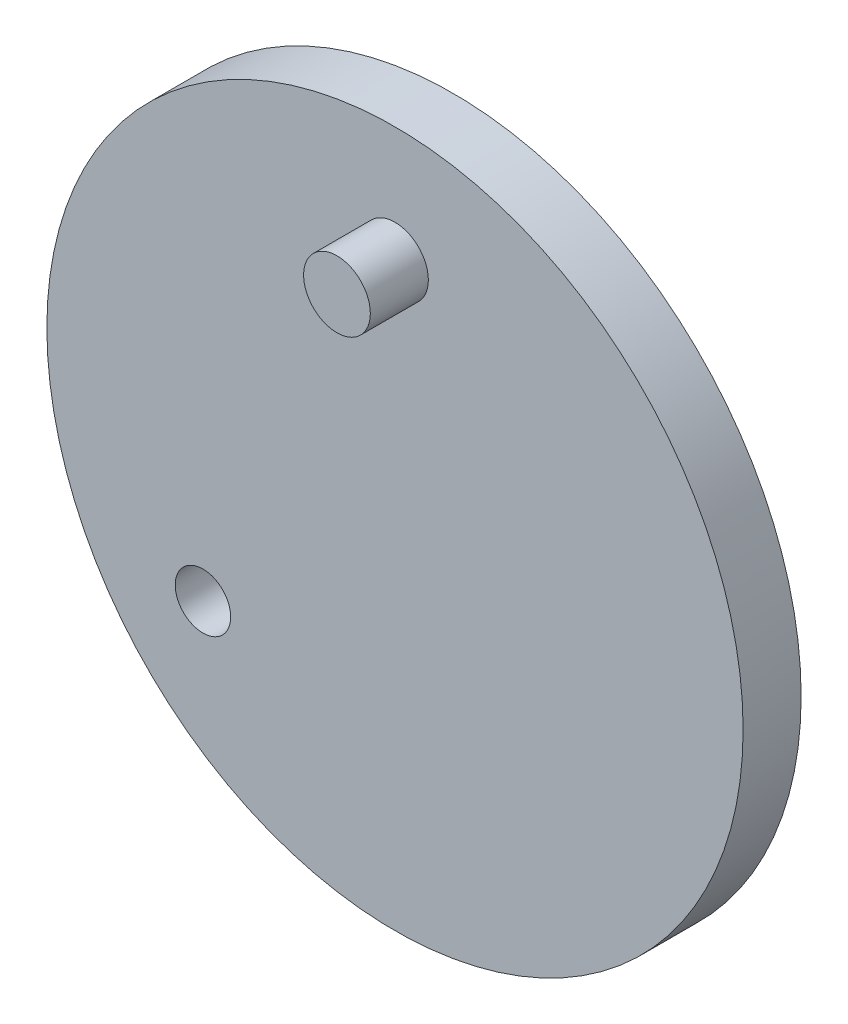
ISO-10303-21;
HEADER;
FILE_DESCRIPTION(('STEP AP214'),'2;1');
FILE_NAME('part.step','',(''),(''),'','','');
FILE_SCHEMA(('AUTOMOTIVE_DESIGN { 1 0 10303 214 1 1 1 1 }'));
ENDSEC;
DATA;
#1=APPLICATION_CONTEXT('core data for automotive mechanical design processes');
#2=APPLICATION_PROTOCOL_DEFINITION('international standard','automotive_design',2000,#1);
#3=PRODUCT_CONTEXT('',#1,'mechanical');
#4=PRODUCT('Part','Part','',(#3));
#5=PRODUCT_RELATED_PRODUCT_CATEGORY('part','',(#4));
#6=PRODUCT_DEFINITION_FORMATION('','',#4);
#7=PRODUCT_DEFINITION_CONTEXT('part definition',#1,'design');
#8=PRODUCT_DEFINITION('design','',#6,#7);
#9=PRODUCT_DEFINITION_SHAPE('','',#8);
#10=(LENGTH_UNIT() NAMED_UNIT(*) SI_UNIT(.MILLI.,.METRE.));
#11=(NAMED_UNIT(*) PLANE_ANGLE_UNIT() SI_UNIT($,.RADIAN.));
#12=(NAMED_UNIT(*) SI_UNIT($,.STERADIAN.) SOLID_ANGLE_UNIT());
#13=UNCERTAINTY_MEASURE_WITH_UNIT(LENGTH_MEASURE(1.E-05),#10,'distance_accuracy_value','');
#14=(GEOMETRIC_REPRESENTATION_CONTEXT(3) GLOBAL_UNCERTAINTY_ASSIGNED_CONTEXT((#13)) GLOBAL_UNIT_ASSIGNED_CONTEXT((#10,
#11,#12)) REPRESENTATION_CONTEXT('',''));
#15=CARTESIAN_POINT('',(0.,0.,0.));
#16=DIRECTION('',(0.,0.,1.));
#17=DIRECTION('',(1.,0.,0.));
#18=AXIS2_PLACEMENT_3D('',#15,#16,#17);
#19=CARTESIAN_POINT('',(0.,0.,5.));
#20=DIRECTION('',(0.,0.,-1.));
#21=DIRECTION('',(-1.,0.,0.));
#22=AXIS2_PLACEMENT_3D('',#19,#20,#21);
#23=CYLINDRICAL_SURFACE('',#22,30.);
#24=CARTESIAN_POINT('',(0.,0.,5.));
#25=DIRECTION('',(0.,0.,1.));
#26=DIRECTION('',(1.,0.,0.));
#27=AXIS2_PLACEMENT_3D('',#24,#25,#26);
#28=CIRCLE('',#27,30.);
#29=CARTESIAN_POINT('',(30.,0.,5.));
#30=VERTEX_POINT('',#29);
#31=EDGE_CURVE('E10',#30,#30,#28,.T.);
#32=ORIENTED_EDGE('',*,*,#31,.F.);
#33=EDGE_LOOP('',(#32));
#34=FACE_BOUND('',#33,.T.);
#35=CARTESIAN_POINT('',(0.,0.,0.));
#36=DIRECTION('',(0.,0.,1.));
#37=DIRECTION('',(1.,0.,0.));
#38=AXIS2_PLACEMENT_3D('',#35,#36,#37);
#39=CIRCLE('',#38,30.);
#40=CARTESIAN_POINT('',(30.,0.,0.));
#41=VERTEX_POINT('',#40);
#42=EDGE_CURVE('E44',#41,#41,#39,.T.);
#43=ORIENTED_EDGE('',*,*,#42,.T.);
#44=EDGE_LOOP('',(#43));
#45=FACE_BOUND('',#44,.T.);
#46=ADVANCED_FACE('F36',(#34,#45),#23,.T.);
#47=CARTESIAN_POINT('',(0.,0.,5.));
#48=DIRECTION('',(0.,0.,1.));
#49=DIRECTION('',(1.,0.,0.));
#50=AXIS2_PLACEMENT_3D('',#47,#48,#49);
#51=PLANE('',#50);
#52=CARTESIAN_POINT('',(-16.5488015478465,-13.6669472553299,5.));
#53=DIRECTION('',(0.,0.,1.));
#54=DIRECTION('',(1.,0.,0.));
#55=AXIS2_PLACEMENT_3D('',#52,#53,#54);
#56=CIRCLE('',#55,2.39073966186304);
#57=CARTESIAN_POINT('',(-14.1580618859834,-13.6669472553299,5.));
#58=VERTEX_POINT('',#57);
#59=EDGE_CURVE('E59',#58,#58,#56,.T.);
#60=ORIENTED_EDGE('',*,*,#59,.F.);
#61=EDGE_LOOP('',(#60));
#62=FACE_BOUND('',#61,.T.);
#63=CARTESIAN_POINT('',(0.,20.,5.));
#64=DIRECTION('',(0.,0.,1.));
#65=DIRECTION('',(1.,0.,0.));
#66=AXIS2_PLACEMENT_3D('',#63,#64,#65);
#67=CIRCLE('',#66,2.875);
#68=CARTESIAN_POINT('',(2.875,20.,5.));
#69=VERTEX_POINT('',#68);
#70=EDGE_CURVE('E52',#69,#69,#67,.T.);
#71=ORIENTED_EDGE('',*,*,#70,.F.);
#72=EDGE_LOOP('',(#71));
#73=FACE_BOUND('',#72,.T.);
#74=ORIENTED_EDGE('',*,*,#31,.T.);
#75=EDGE_LOOP('',(#74));
#76=FACE_BOUND('',#75,.T.);
#77=ADVANCED_FACE('F82',(#62,#73,#76),#51,.T.);
#78=CARTESIAN_POINT('',(0.,0.,0.));
#79=DIRECTION('',(0.,0.,1.));
#80=DIRECTION('',(1.,0.,0.));
#81=AXIS2_PLACEMENT_3D('',#78,#79,#80);
#82=PLANE('',#81);
#83=CARTESIAN_POINT('',(-16.5488015478465,-13.6669472553299,0.));
#84=DIRECTION('',(0.,0.,1.));
#85=DIRECTION('',(1.,0.,0.));
#86=AXIS2_PLACEMENT_3D('',#83,#84,#85);
#87=CIRCLE('',#86,2.39073966186304);
#88=CARTESIAN_POINT('',(-14.1580618859834,-13.6669472553299,0.));
#89=VERTEX_POINT('',#88);
#90=EDGE_CURVE('E39',#89,#89,#87,.T.);
#91=ORIENTED_EDGE('',*,*,#90,.T.);
#92=EDGE_LOOP('',(#91));
#93=FACE_BOUND('',#92,.T.);
#94=ORIENTED_EDGE('',*,*,#42,.F.);
#95=EDGE_LOOP('',(#94));
#96=FACE_BOUND('',#95,.T.);
#97=ADVANCED_FACE('F68',(#93,#96),#82,.F.);
#98=CARTESIAN_POINT('',(0.,20.,10.));
#99=DIRECTION('',(0.,0.,-1.));
#100=DIRECTION('',(-1.,0.,0.));
#101=AXIS2_PLACEMENT_3D('',#98,#99,#100);
#102=CYLINDRICAL_SURFACE('',#101,2.875);
#103=CARTESIAN_POINT('',(0.,20.,10.));
#104=DIRECTION('',(0.,0.,1.));
#105=DIRECTION('',(1.,0.,0.));
#106=AXIS2_PLACEMENT_3D('',#103,#104,#105);
#107=CIRCLE('',#106,2.875);
#108=CARTESIAN_POINT('',(2.875,20.,10.));
#109=VERTEX_POINT('',#108);
#110=EDGE_CURVE('E50',#109,#109,#107,.T.);
#111=ORIENTED_EDGE('',*,*,#110,.F.);
#112=EDGE_LOOP('',(#111));
#113=FACE_BOUND('',#112,.T.);
#114=ORIENTED_EDGE('',*,*,#70,.T.);
#115=EDGE_LOOP('',(#114));
#116=FACE_BOUND('',#115,.T.);
#117=ADVANCED_FACE('F78',(#113,#116),#102,.T.);
#118=CARTESIAN_POINT('',(0.,20.,10.));
#119=DIRECTION('',(0.,0.,1.));
#120=DIRECTION('',(1.,0.,0.));
#121=AXIS2_PLACEMENT_3D('',#118,#119,#120);
#122=PLANE('',#121);
#123=ORIENTED_EDGE('',*,*,#110,.T.);
#124=EDGE_LOOP('',(#123));
#125=FACE_BOUND('',#124,.T.);
#126=ADVANCED_FACE('F73',(#125),#122,.T.);
#127=CARTESIAN_POINT('',(-16.5488015478465,-13.6669472553299,-5.));
#128=DIRECTION('',(0.,0.,1.));
#129=DIRECTION('',(1.,0.,0.));
#130=AXIS2_PLACEMENT_3D('',#127,#128,#129);
#131=CYLINDRICAL_SURFACE('',#130,2.39073966186304);
#132=ORIENTED_EDGE('',*,*,#59,.T.);
#133=EDGE_LOOP('',(#132));
#134=FACE_BOUND('',#133,.T.);
#135=ORIENTED_EDGE('',*,*,#90,.F.);
#136=EDGE_LOOP('',(#135));
#137=FACE_BOUND('',#136,.T.);
#138=ADVANCED_FACE('F71',(#134,#137),#131,.F.);
#139=CLOSED_SHELL('',(#46,#77,#97,#117,#126,#138));
#140=MANIFOLD_SOLID_BREP('B2',#139);
#141=ADVANCED_BREP_SHAPE_REPRESENTATION('',(#18,#140),#14);
#142=SHAPE_DEFINITION_REPRESENTATION(#9,#141);
ENDSEC;
END-ISO-10303-21;
